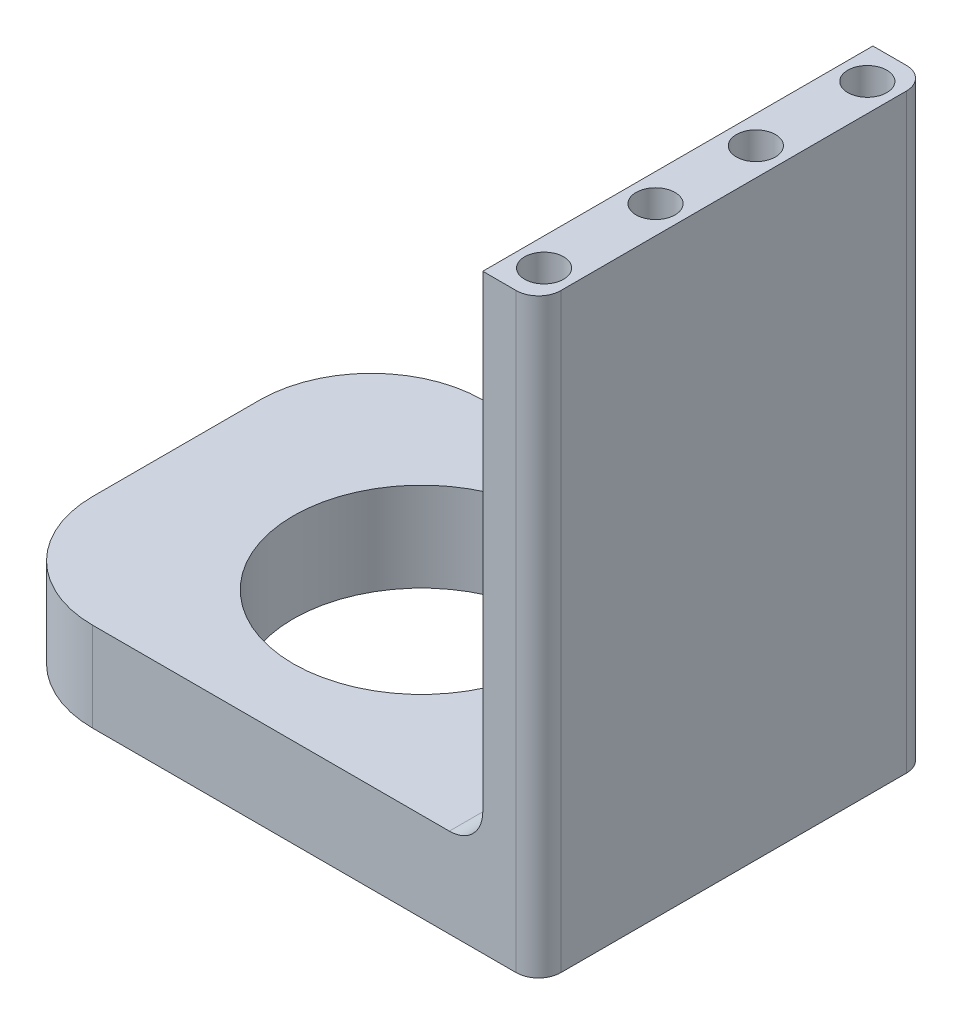
ISO-10303-21;
HEADER;
FILE_DESCRIPTION(('STEP AP214'),'2;1');
FILE_NAME('part.step','',(''),(''),'','','');
FILE_SCHEMA(('AUTOMOTIVE_DESIGN { 1 0 10303 214 1 1 1 1 }'));
ENDSEC;
DATA;
#1=APPLICATION_CONTEXT('core data for automotive mechanical design processes');
#2=APPLICATION_PROTOCOL_DEFINITION('international standard','automotive_design',2000,#1);
#3=PRODUCT_CONTEXT('',#1,'mechanical');
#4=PRODUCT('Part','Part','',(#3));
#5=PRODUCT_RELATED_PRODUCT_CATEGORY('part','',(#4));
#6=PRODUCT_DEFINITION_FORMATION('','',#4);
#7=PRODUCT_DEFINITION_CONTEXT('part definition',#1,'design');
#8=PRODUCT_DEFINITION('design','',#6,#7);
#9=PRODUCT_DEFINITION_SHAPE('','',#8);
#10=(LENGTH_UNIT() NAMED_UNIT(*) SI_UNIT(.MILLI.,.METRE.));
#11=(NAMED_UNIT(*) PLANE_ANGLE_UNIT() SI_UNIT($,.RADIAN.));
#12=(NAMED_UNIT(*) SI_UNIT($,.STERADIAN.) SOLID_ANGLE_UNIT());
#13=UNCERTAINTY_MEASURE_WITH_UNIT(LENGTH_MEASURE(1.E-05),#10,'distance_accuracy_value','');
#14=(GEOMETRIC_REPRESENTATION_CONTEXT(3) GLOBAL_UNCERTAINTY_ASSIGNED_CONTEXT((#13)) GLOBAL_UNIT_ASSIGNED_CONTEXT((#10,
#11,#12)) REPRESENTATION_CONTEXT('',''));
#15=CARTESIAN_POINT('',(0.,0.,0.));
#16=DIRECTION('',(0.,0.,1.));
#17=DIRECTION('',(1.,0.,0.));
#18=AXIS2_PLACEMENT_3D('',#15,#16,#17);
#19=CARTESIAN_POINT('',(0.,8.,0.));
#20=DIRECTION('',(0.,-1.,0.));
#21=DIRECTION('',(0.,0.,-1.));
#22=AXIS2_PLACEMENT_3D('',#19,#20,#21);
#23=PLANE('',#22);
#24=CARTESIAN_POINT('',(0.,8.,0.));
#25=DIRECTION('',(0.,1.,0.));
#26=DIRECTION('',(0.,0.,1.));
#27=AXIS2_PLACEMENT_3D('',#24,#25,#26);
#28=CIRCLE('',#27,11.5);
#29=CARTESIAN_POINT('',(0.,8.,11.5));
#30=VERTEX_POINT('',#29);
#31=EDGE_CURVE('E146',#30,#30,#28,.T.);
#32=ORIENTED_EDGE('',*,*,#31,.F.);
#33=EDGE_LOOP('',(#32));
#34=FACE_BOUND('',#33,.T.);
#35=DIRECTION('',(0.,0.,1.));
#36=VECTOR('',#35,1.);
#37=CARTESIAN_POINT('',(-22.,8.,-17.5));
#38=LINE('',#37,#36);
#39=CARTESIAN_POINT('',(-22.,8.,-7.5));
#40=VERTEX_POINT('',#39);
#41=CARTESIAN_POINT('',(-22.,8.,7.5));
#42=VERTEX_POINT('',#41);
#43=EDGE_CURVE('E155',#40,#42,#38,.T.);
#44=ORIENTED_EDGE('',*,*,#43,.T.);
#45=CARTESIAN_POINT('',(-12.,8.,7.5));
#46=DIRECTION('',(0.,-1.,0.));
#47=DIRECTION('',(0.,0.,-1.));
#48=AXIS2_PLACEMENT_3D('',#45,#46,#47);
#49=CIRCLE('',#48,10.);
#50=CARTESIAN_POINT('',(-12.,8.,17.5));
#51=VERTEX_POINT('',#50);
#52=EDGE_CURVE('E192',#42,#51,#49,.F.);
#53=ORIENTED_EDGE('',*,*,#52,.T.);
#54=DIRECTION('',(1.,0.,0.));
#55=VECTOR('',#54,1.);
#56=CARTESIAN_POINT('',(28.,8.,17.5));
#57=LINE('',#56,#55);
#58=CARTESIAN_POINT('',(20.,8.,17.5));
#59=VERTEX_POINT('',#58);
#60=EDGE_CURVE('E159',#51,#59,#57,.T.);
#61=ORIENTED_EDGE('',*,*,#60,.T.);
#62=DIRECTION('',(0.,0.,1.));
#63=VECTOR('',#62,1.);
#64=CARTESIAN_POINT('',(20.,8.,-17.5));
#65=LINE('',#64,#63);
#66=CARTESIAN_POINT('',(20.,8.,-17.5));
#67=VERTEX_POINT('',#66);
#68=EDGE_CURVE('E171',#59,#67,#65,.F.);
#69=ORIENTED_EDGE('',*,*,#68,.T.);
#70=DIRECTION('',(-1.,0.,0.));
#71=VECTOR('',#70,1.);
#72=CARTESIAN_POINT('',(28.,8.,-17.5));
#73=LINE('',#72,#71);
#74=CARTESIAN_POINT('',(-12.,8.,-17.5));
#75=VERTEX_POINT('',#74);
#76=EDGE_CURVE('E152',#67,#75,#73,.T.);
#77=ORIENTED_EDGE('',*,*,#76,.T.);
#78=CARTESIAN_POINT('',(-12.,8.,-7.5));
#79=DIRECTION('',(0.,-1.,0.));
#80=DIRECTION('',(0.,0.,-1.));
#81=AXIS2_PLACEMENT_3D('',#78,#79,#80);
#82=CIRCLE('',#81,10.);
#83=EDGE_CURVE('E190',#75,#40,#82,.F.);
#84=ORIENTED_EDGE('',*,*,#83,.T.);
#85=EDGE_LOOP('',(#44,#53,#61,#69,#77,#84));
#86=FACE_BOUND('',#85,.T.);
#87=ADVANCED_FACE('F33',(#34,#86),#23,.F.);
#88=CARTESIAN_POINT('',(0.,0.,0.));
#89=DIRECTION('',(0.,-1.,0.));
#90=DIRECTION('',(0.,0.,-1.));
#91=AXIS2_PLACEMENT_3D('',#88,#89,#90);
#92=PLANE('',#91);
#93=DIRECTION('',(0.,0.,-1.));
#94=VECTOR('',#93,1.);
#95=CARTESIAN_POINT('',(28.,0.,-17.5));
#96=LINE('',#95,#94);
#97=CARTESIAN_POINT('',(28.,0.,15.5));
#98=VERTEX_POINT('',#97);
#99=CARTESIAN_POINT('',(28.,0.,-15.5));
#100=VERTEX_POINT('',#99);
#101=EDGE_CURVE('E149',#98,#100,#96,.T.);
#102=ORIENTED_EDGE('',*,*,#101,.F.);
#103=CARTESIAN_POINT('',(26.,0.,15.5));
#104=DIRECTION('',(0.,-1.,0.));
#105=DIRECTION('',(0.,0.,-1.));
#106=AXIS2_PLACEMENT_3D('',#103,#104,#105);
#107=CIRCLE('',#106,2.);
#108=CARTESIAN_POINT('',(26.,0.,17.5));
#109=VERTEX_POINT('',#108);
#110=EDGE_CURVE('E203',#98,#109,#107,.T.);
#111=ORIENTED_EDGE('',*,*,#110,.T.);
#112=DIRECTION('',(1.,0.,0.));
#113=VECTOR('',#112,1.);
#114=CARTESIAN_POINT('',(28.,0.,17.5));
#115=LINE('',#114,#113);
#116=CARTESIAN_POINT('',(-12.,0.,17.5));
#117=VERTEX_POINT('',#116);
#118=EDGE_CURVE('E156',#117,#109,#115,.T.);
#119=ORIENTED_EDGE('',*,*,#118,.F.);
#120=CARTESIAN_POINT('',(-12.,0.,7.5));
#121=DIRECTION('',(0.,-1.,0.));
#122=DIRECTION('',(0.,0.,-1.));
#123=AXIS2_PLACEMENT_3D('',#120,#121,#122);
#124=CIRCLE('',#123,10.);
#125=CARTESIAN_POINT('',(-22.,0.,7.5));
#126=VERTEX_POINT('',#125);
#127=EDGE_CURVE('E183',#117,#126,#124,.T.);
#128=ORIENTED_EDGE('',*,*,#127,.T.);
#129=DIRECTION('',(0.,0.,1.));
#130=VECTOR('',#129,1.);
#131=CARTESIAN_POINT('',(-22.,0.,-17.5));
#132=LINE('',#131,#130);
#133=CARTESIAN_POINT('',(-22.,0.,-7.5));
#134=VERTEX_POINT('',#133);
#135=EDGE_CURVE('E166',#134,#126,#132,.T.);
#136=ORIENTED_EDGE('',*,*,#135,.F.);
#137=CARTESIAN_POINT('',(-12.,0.,-7.5));
#138=DIRECTION('',(0.,-1.,0.));
#139=DIRECTION('',(0.,0.,-1.));
#140=AXIS2_PLACEMENT_3D('',#137,#138,#139);
#141=CIRCLE('',#140,10.);
#142=CARTESIAN_POINT('',(-12.,0.,-17.5));
#143=VERTEX_POINT('',#142);
#144=EDGE_CURVE('E180',#134,#143,#141,.T.);
#145=ORIENTED_EDGE('',*,*,#144,.T.);
#146=DIRECTION('',(-1.,0.,0.));
#147=VECTOR('',#146,1.);
#148=CARTESIAN_POINT('',(28.,0.,-17.5));
#149=LINE('',#148,#147);
#150=CARTESIAN_POINT('',(26.,0.,-17.5));
#151=VERTEX_POINT('',#150);
#152=EDGE_CURVE('E164',#151,#143,#149,.T.);
#153=ORIENTED_EDGE('',*,*,#152,.F.);
#154=CARTESIAN_POINT('',(26.,0.,-15.5));
#155=DIRECTION('',(0.,-1.,0.));
#156=DIRECTION('',(0.,0.,-1.));
#157=AXIS2_PLACEMENT_3D('',#154,#155,#156);
#158=CIRCLE('',#157,2.);
#159=EDGE_CURVE('E201',#151,#100,#158,.T.);
#160=ORIENTED_EDGE('',*,*,#159,.T.);
#161=EDGE_LOOP('',(#102,#111,#119,#128,#136,#145,#153,#160));
#162=FACE_BOUND('',#161,.T.);
#163=CARTESIAN_POINT('',(0.,0.,0.));
#164=DIRECTION('',(0.,1.,0.));
#165=DIRECTION('',(0.,0.,1.));
#166=AXIS2_PLACEMENT_3D('',#163,#164,#165);
#167=CIRCLE('',#166,11.5);
#168=CARTESIAN_POINT('',(0.,0.,11.5));
#169=VERTEX_POINT('',#168);
#170=EDGE_CURVE('E135',#169,#169,#167,.T.);
#171=ORIENTED_EDGE('',*,*,#170,.T.);
#172=EDGE_LOOP('',(#171));
#173=FACE_BOUND('',#172,.T.);
#174=ADVANCED_FACE('F218',(#162,#173),#92,.T.);
#175=CARTESIAN_POINT('',(28.,8.,-17.5));
#176=DIRECTION('',(-1.,0.,0.));
#177=DIRECTION('',(0.,0.,1.));
#178=AXIS2_PLACEMENT_3D('',#175,#176,#177);
#179=PLANE('',#178);
#180=DIRECTION('',(0.,0.,-1.));
#181=VECTOR('',#180,1.);
#182=CARTESIAN_POINT('',(28.,53.,-17.5));
#183=LINE('',#182,#181);
#184=CARTESIAN_POINT('',(28.,53.,15.5));
#185=VERTEX_POINT('',#184);
#186=CARTESIAN_POINT('',(28.,53.,-15.5));
#187=VERTEX_POINT('',#186);
#188=EDGE_CURVE('E124',#185,#187,#183,.T.);
#189=ORIENTED_EDGE('',*,*,#188,.F.);
#190=DIRECTION('',(0.,-1.,0.));
#191=VECTOR('',#190,1.);
#192=CARTESIAN_POINT('',(28.,8.,15.5));
#193=LINE('',#192,#191);
#194=EDGE_CURVE('E198',#185,#98,#193,.T.);
#195=ORIENTED_EDGE('',*,*,#194,.T.);
#196=ORIENTED_EDGE('',*,*,#101,.T.);
#197=DIRECTION('',(0.,-1.,0.));
#198=VECTOR('',#197,1.);
#199=CARTESIAN_POINT('',(28.,8.,-15.5));
#200=LINE('',#199,#198);
#201=EDGE_CURVE('E196',#100,#187,#200,.F.);
#202=ORIENTED_EDGE('',*,*,#201,.T.);
#203=EDGE_LOOP('',(#189,#195,#196,#202));
#204=FACE_BOUND('',#203,.T.);
#205=ADVANCED_FACE('F211',(#204),#179,.F.);
#206=CARTESIAN_POINT('',(28.,8.,-17.5));
#207=DIRECTION('',(0.,0.,1.));
#208=DIRECTION('',(1.,0.,0.));
#209=AXIS2_PLACEMENT_3D('',#206,#207,#208);
#210=PLANE('',#209);
#211=DIRECTION('',(-1.,0.,0.));
#212=VECTOR('',#211,1.);
#213=CARTESIAN_POINT('',(28.,53.,-17.5));
#214=LINE('',#213,#212);
#215=CARTESIAN_POINT('',(26.,53.,-17.5));
#216=VERTEX_POINT('',#215);
#217=CARTESIAN_POINT('',(23.,53.,-17.5));
#218=VERTEX_POINT('',#217);
#219=EDGE_CURVE('E116',#216,#218,#214,.T.);
#220=ORIENTED_EDGE('',*,*,#219,.F.);
#221=DIRECTION('',(0.,-1.,0.));
#222=VECTOR('',#221,1.);
#223=CARTESIAN_POINT('',(26.,8.,-17.5));
#224=LINE('',#223,#222);
#225=EDGE_CURVE('E11',#216,#151,#224,.T.);
#226=ORIENTED_EDGE('',*,*,#225,.T.);
#227=ORIENTED_EDGE('',*,*,#152,.T.);
#228=DIRECTION('',(0.,-1.,0.));
#229=VECTOR('',#228,1.);
#230=CARTESIAN_POINT('',(-12.,8.,-17.5));
#231=LINE('',#230,#229);
#232=EDGE_CURVE('E194',#143,#75,#231,.F.);
#233=ORIENTED_EDGE('',*,*,#232,.T.);
#234=ORIENTED_EDGE('',*,*,#76,.F.);
#235=CARTESIAN_POINT('',(20.,11.,-17.5));
#236=DIRECTION('',(0.,0.,1.));
#237=DIRECTION('',(1.,0.,0.));
#238=AXIS2_PLACEMENT_3D('',#235,#236,#237);
#239=CIRCLE('',#238,3.);
#240=CARTESIAN_POINT('',(23.,11.,-17.5));
#241=VERTEX_POINT('',#240);
#242=EDGE_CURVE('E131',#67,#241,#239,.T.);
#243=ORIENTED_EDGE('',*,*,#242,.T.);
#244=DIRECTION('',(0.,-1.,0.));
#245=VECTOR('',#244,1.);
#246=CARTESIAN_POINT('',(23.,53.,-17.5));
#247=LINE('',#246,#245);
#248=EDGE_CURVE('E127',#218,#241,#247,.T.);
#249=ORIENTED_EDGE('',*,*,#248,.F.);
#250=EDGE_LOOP('',(#220,#226,#227,#233,#234,#243,#249));
#251=FACE_BOUND('',#250,.T.);
#252=ADVANCED_FACE('F128',(#251),#210,.F.);
#253=CARTESIAN_POINT('',(-22.,8.,-17.5));
#254=DIRECTION('',(1.,0.,0.));
#255=DIRECTION('',(0.,0.,-1.));
#256=AXIS2_PLACEMENT_3D('',#253,#254,#255);
#257=PLANE('',#256);
#258=ORIENTED_EDGE('',*,*,#135,.T.);
#259=DIRECTION('',(0.,-1.,0.));
#260=VECTOR('',#259,1.);
#261=CARTESIAN_POINT('',(-22.,8.,7.5));
#262=LINE('',#261,#260);
#263=EDGE_CURVE('E188',#126,#42,#262,.F.);
#264=ORIENTED_EDGE('',*,*,#263,.T.);
#265=ORIENTED_EDGE('',*,*,#43,.F.);
#266=DIRECTION('',(0.,-1.,0.));
#267=VECTOR('',#266,1.);
#268=CARTESIAN_POINT('',(-22.,8.,-7.5));
#269=LINE('',#268,#267);
#270=EDGE_CURVE('E185',#40,#134,#269,.T.);
#271=ORIENTED_EDGE('',*,*,#270,.T.);
#272=EDGE_LOOP('',(#258,#264,#265,#271));
#273=FACE_BOUND('',#272,.T.);
#274=ADVANCED_FACE('F229',(#273),#257,.F.);
#275=CARTESIAN_POINT('',(28.,8.,17.5));
#276=DIRECTION('',(0.,0.,-1.));
#277=DIRECTION('',(-1.,0.,0.));
#278=AXIS2_PLACEMENT_3D('',#275,#276,#277);
#279=PLANE('',#278);
#280=ORIENTED_EDGE('',*,*,#118,.T.);
#281=DIRECTION('',(0.,-1.,0.));
#282=VECTOR('',#281,1.);
#283=CARTESIAN_POINT('',(26.,8.,17.5));
#284=LINE('',#283,#282);
#285=CARTESIAN_POINT('',(26.,53.,17.5));
#286=VERTEX_POINT('',#285);
#287=EDGE_CURVE('E56',#109,#286,#284,.F.);
#288=ORIENTED_EDGE('',*,*,#287,.T.);
#289=DIRECTION('',(1.,0.,0.));
#290=VECTOR('',#289,1.);
#291=CARTESIAN_POINT('',(28.,53.,17.5));
#292=LINE('',#291,#290);
#293=CARTESIAN_POINT('',(23.,53.,17.5));
#294=VERTEX_POINT('',#293);
#295=EDGE_CURVE('E140',#294,#286,#292,.T.);
#296=ORIENTED_EDGE('',*,*,#295,.F.);
#297=DIRECTION('',(0.,-1.,0.));
#298=VECTOR('',#297,1.);
#299=CARTESIAN_POINT('',(23.,53.,17.5));
#300=LINE('',#299,#298);
#301=CARTESIAN_POINT('',(23.,11.,17.5));
#302=VERTEX_POINT('',#301);
#303=EDGE_CURVE('E136',#294,#302,#300,.T.);
#304=ORIENTED_EDGE('',*,*,#303,.T.);
#305=CARTESIAN_POINT('',(20.,11.,17.5));
#306=DIRECTION('',(0.,0.,-1.));
#307=DIRECTION('',(-1.,0.,0.));
#308=AXIS2_PLACEMENT_3D('',#305,#306,#307);
#309=CIRCLE('',#308,3.);
#310=EDGE_CURVE('E173',#302,#59,#309,.T.);
#311=ORIENTED_EDGE('',*,*,#310,.T.);
#312=ORIENTED_EDGE('',*,*,#60,.F.);
#313=DIRECTION('',(0.,-1.,0.));
#314=VECTOR('',#313,1.);
#315=CARTESIAN_POINT('',(-12.,8.,17.5));
#316=LINE('',#315,#314);
#317=EDGE_CURVE('E177',#51,#117,#316,.T.);
#318=ORIENTED_EDGE('',*,*,#317,.T.);
#319=EDGE_LOOP('',(#280,#288,#296,#304,#311,#312,#318));
#320=FACE_BOUND('',#319,.T.);
#321=ADVANCED_FACE('F220',(#320),#279,.F.);
#322=CARTESIAN_POINT('',(0.,8.,0.));
#323=DIRECTION('',(0.,-1.,0.));
#324=DIRECTION('',(0.,0.,-1.));
#325=AXIS2_PLACEMENT_3D('',#322,#323,#324);
#326=CYLINDRICAL_SURFACE('',#325,11.5);
#327=ORIENTED_EDGE('',*,*,#31,.T.);
#328=EDGE_LOOP('',(#327));
#329=FACE_BOUND('',#328,.T.);
#330=ORIENTED_EDGE('',*,*,#170,.F.);
#331=EDGE_LOOP('',(#330));
#332=FACE_BOUND('',#331,.T.);
#333=ADVANCED_FACE('F252',(#329,#332),#326,.F.);
#334=CARTESIAN_POINT('',(23.,53.,-17.5));
#335=DIRECTION('',(1.,0.,0.));
#336=DIRECTION('',(0.,0.,-1.));
#337=AXIS2_PLACEMENT_3D('',#334,#335,#336);
#338=PLANE('',#337);
#339=ORIENTED_EDGE('',*,*,#248,.T.);
#340=DIRECTION('',(0.,0.,1.));
#341=VECTOR('',#340,1.);
#342=CARTESIAN_POINT('',(23.,11.,17.5));
#343=LINE('',#342,#341);
#344=EDGE_CURVE('E161',#241,#302,#343,.T.);
#345=ORIENTED_EDGE('',*,*,#344,.T.);
#346=ORIENTED_EDGE('',*,*,#303,.F.);
#347=DIRECTION('',(0.,0.,1.));
#348=VECTOR('',#347,1.);
#349=CARTESIAN_POINT('',(23.,53.,-17.5));
#350=LINE('',#349,#348);
#351=EDGE_CURVE('E120',#218,#294,#350,.T.);
#352=ORIENTED_EDGE('',*,*,#351,.F.);
#353=EDGE_LOOP('',(#339,#345,#346,#352));
#354=FACE_BOUND('',#353,.T.);
#355=ADVANCED_FACE('F138',(#354),#338,.F.);
#356=CARTESIAN_POINT('',(0.,53.,0.));
#357=DIRECTION('',(0.,-1.,0.));
#358=DIRECTION('',(0.,0.,-1.));
#359=AXIS2_PLACEMENT_3D('',#356,#357,#358);
#360=PLANE('',#359);
#361=CARTESIAN_POINT('',(25.5,53.,-14.5));
#362=DIRECTION('',(0.,1.,0.));
#363=DIRECTION('',(0.,0.,1.));
#364=AXIS2_PLACEMENT_3D('',#361,#362,#363);
#365=CIRCLE('',#364,1.75);
#366=CARTESIAN_POINT('',(25.5,53.,-12.75));
#367=VERTEX_POINT('',#366);
#368=EDGE_CURVE('E449',#367,#367,#365,.T.);
#369=ORIENTED_EDGE('',*,*,#368,.F.);
#370=EDGE_LOOP('',(#369));
#371=FACE_BOUND('',#370,.T.);
#372=CARTESIAN_POINT('',(25.5,53.,4.49999999999999));
#373=DIRECTION('',(0.,1.,0.));
#374=DIRECTION('',(0.,0.,1.));
#375=AXIS2_PLACEMENT_3D('',#372,#373,#374);
#376=CIRCLE('',#375,1.75);
#377=CARTESIAN_POINT('',(25.5,53.,6.24999999999999));
#378=VERTEX_POINT('',#377);
#379=EDGE_CURVE('E461',#378,#378,#376,.T.);
#380=ORIENTED_EDGE('',*,*,#379,.F.);
#381=EDGE_LOOP('',(#380));
#382=FACE_BOUND('',#381,.T.);
#383=CARTESIAN_POINT('',(25.5,53.,-4.5));
#384=DIRECTION('',(0.,1.,0.));
#385=DIRECTION('',(0.,0.,1.));
#386=AXIS2_PLACEMENT_3D('',#383,#384,#385);
#387=CIRCLE('',#386,1.75);
#388=CARTESIAN_POINT('',(25.5,53.,-2.75));
#389=VERTEX_POINT('',#388);
#390=EDGE_CURVE('E452',#389,#389,#387,.T.);
#391=ORIENTED_EDGE('',*,*,#390,.F.);
#392=EDGE_LOOP('',(#391));
#393=FACE_BOUND('',#392,.T.);
#394=CARTESIAN_POINT('',(25.5,53.,14.5));
#395=DIRECTION('',(0.,1.,0.));
#396=DIRECTION('',(0.,0.,1.));
#397=AXIS2_PLACEMENT_3D('',#394,#395,#396);
#398=CIRCLE('',#397,1.75);
#399=CARTESIAN_POINT('',(25.5,53.,16.25));
#400=VERTEX_POINT('',#399);
#401=EDGE_CURVE('E445',#400,#400,#398,.T.);
#402=ORIENTED_EDGE('',*,*,#401,.F.);
#403=EDGE_LOOP('',(#402));
#404=FACE_BOUND('',#403,.T.);
#405=ORIENTED_EDGE('',*,*,#295,.T.);
#406=CARTESIAN_POINT('',(26.,53.,15.5));
#407=DIRECTION('',(0.,-1.,0.));
#408=DIRECTION('',(0.,0.,-1.));
#409=AXIS2_PLACEMENT_3D('',#406,#407,#408);
#410=CIRCLE('',#409,2.);
#411=EDGE_CURVE('E41',#286,#185,#410,.F.);
#412=ORIENTED_EDGE('',*,*,#411,.T.);
#413=ORIENTED_EDGE('',*,*,#188,.T.);
#414=CARTESIAN_POINT('',(26.,53.,-15.5));
#415=DIRECTION('',(0.,-1.,0.));
#416=DIRECTION('',(0.,0.,-1.));
#417=AXIS2_PLACEMENT_3D('',#414,#415,#416);
#418=CIRCLE('',#417,2.);
#419=EDGE_CURVE('E48',#187,#216,#418,.F.);
#420=ORIENTED_EDGE('',*,*,#419,.T.);
#421=ORIENTED_EDGE('',*,*,#219,.T.);
#422=ORIENTED_EDGE('',*,*,#351,.T.);
#423=EDGE_LOOP('',(#405,#412,#413,#420,#421,#422));
#424=FACE_BOUND('',#423,.T.);
#425=ADVANCED_FACE('F118',(#371,#382,#393,#404,#424),#360,.F.);
#426=CARTESIAN_POINT('',(20.,11.,-17.5));
#427=DIRECTION('',(0.,0.,-1.));
#428=DIRECTION('',(-1.,0.,0.));
#429=AXIS2_PLACEMENT_3D('',#426,#427,#428);
#430=CYLINDRICAL_SURFACE('',#429,3.);
#431=ORIENTED_EDGE('',*,*,#242,.F.);
#432=ORIENTED_EDGE('',*,*,#68,.F.);
#433=ORIENTED_EDGE('',*,*,#310,.F.);
#434=ORIENTED_EDGE('',*,*,#344,.F.);
#435=EDGE_LOOP('',(#431,#432,#433,#434));
#436=FACE_BOUND('',#435,.T.);
#437=ADVANCED_FACE('F263',(#436),#430,.F.);
#438=CARTESIAN_POINT('',(25.5,43.,14.5));
#439=DIRECTION('',(0.,1.,0.));
#440=DIRECTION('',(0.,0.,1.));
#441=AXIS2_PLACEMENT_3D('',#438,#439,#440);
#442=CYLINDRICAL_SURFACE('',#441,1.75);
#443=CARTESIAN_POINT('',(25.5,43.,14.5));
#444=DIRECTION('',(0.,1.,0.));
#445=DIRECTION('',(0.,0.,1.));
#446=AXIS2_PLACEMENT_3D('',#443,#444,#445);
#447=CIRCLE('',#446,1.75);
#448=CARTESIAN_POINT('',(25.5,43.,16.25));
#449=VERTEX_POINT('',#448);
#450=EDGE_CURVE('E442',#449,#449,#447,.T.);
#451=ORIENTED_EDGE('',*,*,#450,.F.);
#452=EDGE_LOOP('',(#451));
#453=FACE_BOUND('',#452,.T.);
#454=ORIENTED_EDGE('',*,*,#401,.T.);
#455=EDGE_LOOP('',(#454));
#456=FACE_BOUND('',#455,.T.);
#457=ADVANCED_FACE('F266',(#453,#456),#442,.F.);
#458=CARTESIAN_POINT('',(25.5,43.,14.5));
#459=DIRECTION('',(0.,1.,0.));
#460=DIRECTION('',(0.,0.,1.));
#461=AXIS2_PLACEMENT_3D('',#458,#459,#460);
#462=PLANE('',#461);
#463=ORIENTED_EDGE('',*,*,#450,.T.);
#464=EDGE_LOOP('',(#463));
#465=FACE_BOUND('',#464,.T.);
#466=ADVANCED_FACE('F406',(#465),#462,.T.);
#467=CARTESIAN_POINT('',(25.5,43.,-4.5));
#468=DIRECTION('',(0.,1.,0.));
#469=DIRECTION('',(0.,0.,1.));
#470=AXIS2_PLACEMENT_3D('',#467,#468,#469);
#471=CYLINDRICAL_SURFACE('',#470,1.75);
#472=CARTESIAN_POINT('',(25.5,43.,-4.5));
#473=DIRECTION('',(0.,1.,0.));
#474=DIRECTION('',(0.,0.,1.));
#475=AXIS2_PLACEMENT_3D('',#472,#473,#474);
#476=CIRCLE('',#475,1.75);
#477=CARTESIAN_POINT('',(25.5,43.,-2.75));
#478=VERTEX_POINT('',#477);
#479=EDGE_CURVE('E447',#478,#478,#476,.T.);
#480=ORIENTED_EDGE('',*,*,#479,.F.);
#481=EDGE_LOOP('',(#480));
#482=FACE_BOUND('',#481,.T.);
#483=ORIENTED_EDGE('',*,*,#390,.T.);
#484=EDGE_LOOP('',(#483));
#485=FACE_BOUND('',#484,.T.);
#486=ADVANCED_FACE('F396',(#482,#485),#471,.F.);
#487=CARTESIAN_POINT('',(25.5,43.,-4.5));
#488=DIRECTION('',(0.,1.,0.));
#489=DIRECTION('',(0.,0.,1.));
#490=AXIS2_PLACEMENT_3D('',#487,#488,#489);
#491=PLANE('',#490);
#492=ORIENTED_EDGE('',*,*,#479,.T.);
#493=EDGE_LOOP('',(#492));
#494=FACE_BOUND('',#493,.T.);
#495=ADVANCED_FACE('F386',(#494),#491,.T.);
#496=CARTESIAN_POINT('',(25.5,43.,4.49999999999999));
#497=DIRECTION('',(0.,1.,0.));
#498=DIRECTION('',(0.,0.,1.));
#499=AXIS2_PLACEMENT_3D('',#496,#497,#498);
#500=CYLINDRICAL_SURFACE('',#499,1.75);
#501=CARTESIAN_POINT('',(25.5,43.,4.49999999999999));
#502=DIRECTION('',(0.,1.,0.));
#503=DIRECTION('',(0.,0.,1.));
#504=AXIS2_PLACEMENT_3D('',#501,#502,#503);
#505=CIRCLE('',#504,1.75);
#506=CARTESIAN_POINT('',(25.5,43.,6.24999999999999));
#507=VERTEX_POINT('',#506);
#508=EDGE_CURVE('E457',#507,#507,#505,.T.);
#509=ORIENTED_EDGE('',*,*,#508,.F.);
#510=EDGE_LOOP('',(#509));
#511=FACE_BOUND('',#510,.T.);
#512=ORIENTED_EDGE('',*,*,#379,.T.);
#513=EDGE_LOOP('',(#512));
#514=FACE_BOUND('',#513,.T.);
#515=ADVANCED_FACE('F376',(#511,#514),#500,.F.);
#516=CARTESIAN_POINT('',(25.5,43.,4.49999999999999));
#517=DIRECTION('',(0.,1.,0.));
#518=DIRECTION('',(0.,0.,1.));
#519=AXIS2_PLACEMENT_3D('',#516,#517,#518);
#520=PLANE('',#519);
#521=ORIENTED_EDGE('',*,*,#508,.T.);
#522=EDGE_LOOP('',(#521));
#523=FACE_BOUND('',#522,.T.);
#524=ADVANCED_FACE('F366',(#523),#520,.T.);
#525=CARTESIAN_POINT('',(25.5,43.,-14.5));
#526=DIRECTION('',(0.,1.,0.));
#527=DIRECTION('',(0.,0.,1.));
#528=AXIS2_PLACEMENT_3D('',#525,#526,#527);
#529=CYLINDRICAL_SURFACE('',#528,1.75);
#530=CARTESIAN_POINT('',(25.5,43.,-14.5));
#531=DIRECTION('',(0.,1.,0.));
#532=DIRECTION('',(0.,0.,1.));
#533=AXIS2_PLACEMENT_3D('',#530,#531,#532);
#534=CIRCLE('',#533,1.75);
#535=CARTESIAN_POINT('',(25.5,43.,-12.75));
#536=VERTEX_POINT('',#535);
#537=EDGE_CURVE('E214',#536,#536,#534,.T.);
#538=ORIENTED_EDGE('',*,*,#537,.F.);
#539=EDGE_LOOP('',(#538));
#540=FACE_BOUND('',#539,.T.);
#541=ORIENTED_EDGE('',*,*,#368,.T.);
#542=EDGE_LOOP('',(#541));
#543=FACE_BOUND('',#542,.T.);
#544=ADVANCED_FACE('F355',(#540,#543),#529,.F.);
#545=CARTESIAN_POINT('',(25.5,43.,-14.5));
#546=DIRECTION('',(0.,1.,0.));
#547=DIRECTION('',(0.,0.,1.));
#548=AXIS2_PLACEMENT_3D('',#545,#546,#547);
#549=PLANE('',#548);
#550=ORIENTED_EDGE('',*,*,#537,.T.);
#551=EDGE_LOOP('',(#550));
#552=FACE_BOUND('',#551,.T.);
#553=ADVANCED_FACE('F270',(#552),#549,.T.);
#554=CARTESIAN_POINT('',(-12.,8.,7.5));
#555=DIRECTION('',(0.,-1.,0.));
#556=DIRECTION('',(0.,0.,-1.));
#557=AXIS2_PLACEMENT_3D('',#554,#555,#556);
#558=CYLINDRICAL_SURFACE('',#557,10.);
#559=ORIENTED_EDGE('',*,*,#52,.F.);
#560=ORIENTED_EDGE('',*,*,#263,.F.);
#561=ORIENTED_EDGE('',*,*,#127,.F.);
#562=ORIENTED_EDGE('',*,*,#317,.F.);
#563=EDGE_LOOP('',(#559,#560,#561,#562));
#564=FACE_BOUND('',#563,.T.);
#565=ADVANCED_FACE('F225',(#564),#558,.T.);
#566=CARTESIAN_POINT('',(-12.,8.,-7.5));
#567=DIRECTION('',(0.,-1.,0.));
#568=DIRECTION('',(0.,0.,-1.));
#569=AXIS2_PLACEMENT_3D('',#566,#567,#568);
#570=CYLINDRICAL_SURFACE('',#569,10.);
#571=ORIENTED_EDGE('',*,*,#83,.F.);
#572=ORIENTED_EDGE('',*,*,#232,.F.);
#573=ORIENTED_EDGE('',*,*,#144,.F.);
#574=ORIENTED_EDGE('',*,*,#270,.F.);
#575=EDGE_LOOP('',(#571,#572,#573,#574));
#576=FACE_BOUND('',#575,.T.);
#577=ADVANCED_FACE('F234',(#576),#570,.T.);
#578=CARTESIAN_POINT('',(26.,8.,15.5));
#579=DIRECTION('',(0.,-1.,0.));
#580=DIRECTION('',(0.,0.,-1.));
#581=AXIS2_PLACEMENT_3D('',#578,#579,#580);
#582=CYLINDRICAL_SURFACE('',#581,2.);
#583=ORIENTED_EDGE('',*,*,#411,.F.);
#584=ORIENTED_EDGE('',*,*,#287,.F.);
#585=ORIENTED_EDGE('',*,*,#110,.F.);
#586=ORIENTED_EDGE('',*,*,#194,.F.);
#587=EDGE_LOOP('',(#583,#584,#585,#586));
#588=FACE_BOUND('',#587,.T.);
#589=ADVANCED_FACE('F215',(#588),#582,.T.);
#590=CARTESIAN_POINT('',(26.,8.,-15.5));
#591=DIRECTION('',(0.,-1.,0.));
#592=DIRECTION('',(0.,0.,-1.));
#593=AXIS2_PLACEMENT_3D('',#590,#591,#592);
#594=CYLINDRICAL_SURFACE('',#593,2.);
#595=ORIENTED_EDGE('',*,*,#419,.F.);
#596=ORIENTED_EDGE('',*,*,#201,.F.);
#597=ORIENTED_EDGE('',*,*,#159,.F.);
#598=ORIENTED_EDGE('',*,*,#225,.F.);
#599=EDGE_LOOP('',(#595,#596,#597,#598));
#600=FACE_BOUND('',#599,.T.);
#601=ADVANCED_FACE('F35',(#600),#594,.T.);
#602=CLOSED_SHELL('',(#87,#174,#205,#252,#274,#321,#333,#355,#425,#437,#457,#466,#486,#495,#515,
#524,#544,#553,#565,#577,#589,#601));
#603=MANIFOLD_SOLID_BREP('B2',#602);
#604=ADVANCED_BREP_SHAPE_REPRESENTATION('',(#18,#603),#14);
#605=SHAPE_DEFINITION_REPRESENTATION(#9,#604);
ENDSEC;
END-ISO-10303-21;
